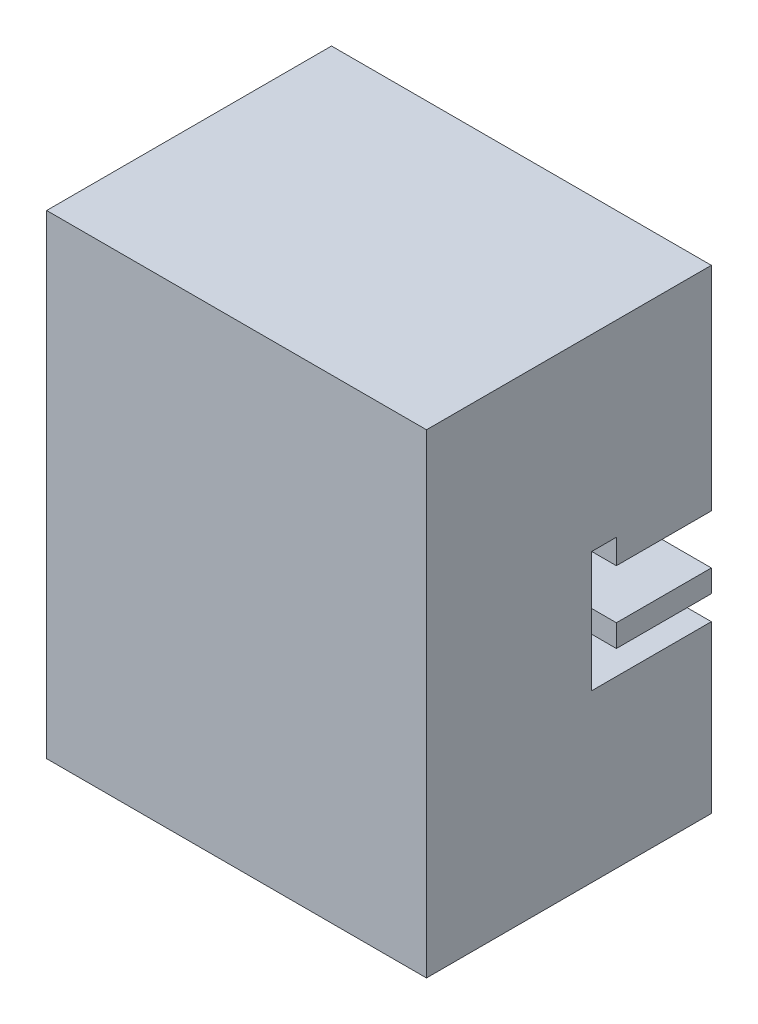
ISO-10303-21;
HEADER;
FILE_DESCRIPTION(('STEP AP214'),'2;1');
FILE_NAME('part.step','',(''),(''),'','','');
FILE_SCHEMA(('AUTOMOTIVE_DESIGN { 1 0 10303 214 1 1 1 1 }'));
ENDSEC;
DATA;
#1=APPLICATION_CONTEXT('core data for automotive mechanical design processes');
#2=APPLICATION_PROTOCOL_DEFINITION('international standard','automotive_design',2000,#1);
#3=PRODUCT_CONTEXT('',#1,'mechanical');
#4=PRODUCT('Part','Part','',(#3));
#5=PRODUCT_RELATED_PRODUCT_CATEGORY('part','',(#4));
#6=PRODUCT_DEFINITION_FORMATION('','',#4);
#7=PRODUCT_DEFINITION_CONTEXT('part definition',#1,'design');
#8=PRODUCT_DEFINITION('design','',#6,#7);
#9=PRODUCT_DEFINITION_SHAPE('','',#8);
#10=(LENGTH_UNIT() NAMED_UNIT(*) SI_UNIT(.MILLI.,.METRE.));
#11=(NAMED_UNIT(*) PLANE_ANGLE_UNIT() SI_UNIT($,.RADIAN.));
#12=(NAMED_UNIT(*) SI_UNIT($,.STERADIAN.) SOLID_ANGLE_UNIT());
#13=UNCERTAINTY_MEASURE_WITH_UNIT(LENGTH_MEASURE(1.E-05),#10,'distance_accuracy_value','');
#14=(GEOMETRIC_REPRESENTATION_CONTEXT(3) GLOBAL_UNCERTAINTY_ASSIGNED_CONTEXT((#13)) GLOBAL_UNIT_ASSIGNED_CONTEXT((#10,
#11,#12)) REPRESENTATION_CONTEXT('',''));
#15=CARTESIAN_POINT('',(0.,0.,0.));
#16=DIRECTION('',(0.,0.,1.));
#17=DIRECTION('',(1.,0.,0.));
#18=AXIS2_PLACEMENT_3D('',#15,#16,#17);
#19=CARTESIAN_POINT('',(0.,0.,30.));
#20=DIRECTION('',(1.,0.,0.));
#21=DIRECTION('',(0.,0.,-1.));
#22=AXIS2_PLACEMENT_3D('',#19,#20,#21);
#23=PLANE('',#22);
#24=DIRECTION('',(0.,1.,0.));
#25=VECTOR('',#24,1.);
#26=CARTESIAN_POINT('',(0.,30.2,12.6));
#27=LINE('',#26,#25);
#28=CARTESIAN_POINT('',(0.,17.5,12.6));
#29=VERTEX_POINT('',#28);
#30=CARTESIAN_POINT('',(0.,30.2,12.6));
#31=VERTEX_POINT('',#30);
#32=EDGE_CURVE('E73',#29,#31,#27,.T.);
#33=ORIENTED_EDGE('',*,*,#32,.F.);
#34=DIRECTION('',(0.,0.,-1.));
#35=VECTOR('',#34,1.);
#36=CARTESIAN_POINT('',(0.,17.5,53.8554238858359));
#37=LINE('',#36,#35);
#38=CARTESIAN_POINT('',(0.,17.5,0.));
#39=VERTEX_POINT('',#38);
#40=EDGE_CURVE('E180',#29,#39,#37,.T.);
#41=ORIENTED_EDGE('',*,*,#40,.T.);
#42=DIRECTION('',(0.,-1.,0.));
#43=VECTOR('',#42,1.);
#44=CARTESIAN_POINT('',(0.,0.,0.));
#45=LINE('',#44,#43);
#46=CARTESIAN_POINT('',(0.,0.,0.));
#47=VERTEX_POINT('',#46);
#48=EDGE_CURVE('E171',#39,#47,#45,.T.);
#49=ORIENTED_EDGE('',*,*,#48,.T.);
#50=DIRECTION('',(0.,0.,-1.));
#51=VECTOR('',#50,1.);
#52=CARTESIAN_POINT('',(0.,0.,30.));
#53=LINE('',#52,#51);
#54=CARTESIAN_POINT('',(0.,0.,30.));
#55=VERTEX_POINT('',#54);
#56=EDGE_CURVE('E235',#55,#47,#53,.T.);
#57=ORIENTED_EDGE('',*,*,#56,.F.);
#58=DIRECTION('',(0.,-1.,0.));
#59=VECTOR('',#58,1.);
#60=CARTESIAN_POINT('',(0.,0.,30.));
#61=LINE('',#60,#59);
#62=CARTESIAN_POINT('',(0.,50.,30.));
#63=VERTEX_POINT('',#62);
#64=EDGE_CURVE('E169',#63,#55,#61,.T.);
#65=ORIENTED_EDGE('',*,*,#64,.F.);
#66=DIRECTION('',(0.,0.,-1.));
#67=VECTOR('',#66,1.);
#68=CARTESIAN_POINT('',(0.,50.,30.));
#69=LINE('',#68,#67);
#70=CARTESIAN_POINT('',(0.,50.,0.));
#71=VERTEX_POINT('',#70);
#72=EDGE_CURVE('E155',#63,#71,#69,.T.);
#73=ORIENTED_EDGE('',*,*,#72,.T.);
#74=CARTESIAN_POINT('',(0.,27.6,0.));
#75=VERTEX_POINT('',#74);
#76=EDGE_CURVE('E166',#71,#75,#45,.T.);
#77=ORIENTED_EDGE('',*,*,#76,.T.);
#78=DIRECTION('',(0.,0.,-1.));
#79=VECTOR('',#78,1.);
#80=CARTESIAN_POINT('',(0.,27.6,0.));
#81=LINE('',#80,#79);
#82=CARTESIAN_POINT('',(0.,27.6,10.));
#83=VERTEX_POINT('',#82);
#84=EDGE_CURVE('E177',#83,#75,#81,.T.);
#85=ORIENTED_EDGE('',*,*,#84,.F.);
#86=DIRECTION('',(0.,-1.,0.));
#87=VECTOR('',#86,1.);
#88=CARTESIAN_POINT('',(0.,27.6,10.));
#89=LINE('',#88,#87);
#90=CARTESIAN_POINT('',(0.,30.2,10.));
#91=VERTEX_POINT('',#90);
#92=EDGE_CURVE('E203',#91,#83,#89,.T.);
#93=ORIENTED_EDGE('',*,*,#92,.F.);
#94=DIRECTION('',(0.,0.,-1.));
#95=VECTOR('',#94,1.);
#96=CARTESIAN_POINT('',(0.,30.2,10.));
#97=LINE('',#96,#95);
#98=EDGE_CURVE('E190',#31,#91,#97,.T.);
#99=ORIENTED_EDGE('',*,*,#98,.F.);
#100=EDGE_LOOP('',(#33,#41,#49,#57,#65,#73,#77,#85,#93,#99));
#101=FACE_BOUND('',#100,.T.);
#102=ADVANCED_FACE('F54',(#101),#23,.F.);
#103=CARTESIAN_POINT('',(0.,0.,0.));
#104=DIRECTION('',(0.,0.,-1.));
#105=DIRECTION('',(-1.,0.,0.));
#106=AXIS2_PLACEMENT_3D('',#103,#104,#105);
#107=PLANE('',#106);
#108=DIRECTION('',(-1.,0.,0.));
#109=VECTOR('',#108,1.);
#110=CARTESIAN_POINT('',(0.,17.5,0.));
#111=LINE('',#110,#109);
#112=CARTESIAN_POINT('',(40.,17.5,0.));
#113=VERTEX_POINT('',#112);
#114=EDGE_CURVE('E12',#113,#39,#111,.T.);
#115=ORIENTED_EDGE('',*,*,#114,.F.);
#116=DIRECTION('',(0.,1.,0.));
#117=VECTOR('',#116,1.);
#118=CARTESIAN_POINT('',(40.,0.,0.));
#119=LINE('',#118,#117);
#120=CARTESIAN_POINT('',(40.,0.,0.));
#121=VERTEX_POINT('',#120);
#122=EDGE_CURVE('E58',#121,#113,#119,.T.);
#123=ORIENTED_EDGE('',*,*,#122,.F.);
#124=DIRECTION('',(1.,0.,0.));
#125=VECTOR('',#124,1.);
#126=CARTESIAN_POINT('',(0.,0.,0.));
#127=LINE('',#126,#125);
#128=EDGE_CURVE('E220',#47,#121,#127,.T.);
#129=ORIENTED_EDGE('',*,*,#128,.F.);
#130=ORIENTED_EDGE('',*,*,#48,.F.);
#131=EDGE_LOOP('',(#115,#123,#129,#130));
#132=FACE_BOUND('',#131,.T.);
#133=ADVANCED_FACE('F254',(#132),#107,.T.);
#134=CARTESIAN_POINT('',(40.001,27.6,0.));
#135=DIRECTION('',(0.,1.,0.));
#136=DIRECTION('',(0.,0.,1.));
#137=AXIS2_PLACEMENT_3D('',#134,#135,#136);
#138=PLANE('',#137);
#139=DIRECTION('',(-1.,0.,0.));
#140=VECTOR('',#139,1.);
#141=CARTESIAN_POINT('',(40.001,27.6,10.));
#142=LINE('',#141,#140);
#143=CARTESIAN_POINT('',(40.,27.6,10.));
#144=VERTEX_POINT('',#143);
#145=EDGE_CURVE('E175',#144,#83,#142,.T.);
#146=ORIENTED_EDGE('',*,*,#145,.T.);
#147=ORIENTED_EDGE('',*,*,#84,.T.);
#148=DIRECTION('',(-1.,0.,0.));
#149=VECTOR('',#148,1.);
#150=CARTESIAN_POINT('',(40.001,27.6,0.));
#151=LINE('',#150,#149);
#152=CARTESIAN_POINT('',(40.,27.6,0.));
#153=VERTEX_POINT('',#152);
#154=EDGE_CURVE('E124',#153,#75,#151,.T.);
#155=ORIENTED_EDGE('',*,*,#154,.F.);
#156=DIRECTION('',(0.,0.,1.));
#157=VECTOR('',#156,1.);
#158=CARTESIAN_POINT('',(40.,27.6,0.));
#159=LINE('',#158,#157);
#160=EDGE_CURVE('E207',#153,#144,#159,.T.);
#161=ORIENTED_EDGE('',*,*,#160,.T.);
#162=EDGE_LOOP('',(#146,#147,#155,#161));
#163=FACE_BOUND('',#162,.T.);
#164=ADVANCED_FACE('F270',(#163),#138,.F.);
#165=CARTESIAN_POINT('',(40.001,30.2,12.6));
#166=DIRECTION('',(0.,0.,1.));
#167=DIRECTION('',(1.,0.,0.));
#168=AXIS2_PLACEMENT_3D('',#165,#166,#167);
#169=PLANE('',#168);
#170=DIRECTION('',(-1.,0.,0.));
#171=VECTOR('',#170,1.);
#172=CARTESIAN_POINT('',(40.001,30.2,12.6));
#173=LINE('',#172,#171);
#174=CARTESIAN_POINT('',(40.,30.2,12.6));
#175=VERTEX_POINT('',#174);
#176=EDGE_CURVE('E193',#175,#31,#173,.T.);
#177=ORIENTED_EDGE('',*,*,#176,.F.);
#178=DIRECTION('',(0.,-1.,0.));
#179=VECTOR('',#178,1.);
#180=CARTESIAN_POINT('',(40.,30.2,12.6));
#181=LINE('',#180,#179);
#182=CARTESIAN_POINT('',(40.,17.5,12.6));
#183=VERTEX_POINT('',#182);
#184=EDGE_CURVE('E90',#175,#183,#181,.T.);
#185=ORIENTED_EDGE('',*,*,#184,.T.);
#186=DIRECTION('',(-1.,0.,0.));
#187=VECTOR('',#186,1.);
#188=CARTESIAN_POINT('',(0.,17.5,12.6));
#189=LINE('',#188,#187);
#190=EDGE_CURVE('E188',#183,#29,#189,.T.);
#191=ORIENTED_EDGE('',*,*,#190,.T.);
#192=ORIENTED_EDGE('',*,*,#32,.T.);
#193=EDGE_LOOP('',(#177,#185,#191,#192));
#194=FACE_BOUND('',#193,.T.);
#195=ADVANCED_FACE('F273',(#194),#169,.F.);
#196=ORIENTED_EDGE('',*,*,#154,.T.);
#197=ORIENTED_EDGE('',*,*,#76,.F.);
#198=DIRECTION('',(-1.,0.,0.));
#199=VECTOR('',#198,1.);
#200=CARTESIAN_POINT('',(0.,50.,0.));
#201=LINE('',#200,#199);
#202=CARTESIAN_POINT('',(40.,50.,0.));
#203=VERTEX_POINT('',#202);
#204=EDGE_CURVE('E151',#203,#71,#201,.T.);
#205=ORIENTED_EDGE('',*,*,#204,.F.);
#206=EDGE_CURVE('E243',#153,#203,#119,.T.);
#207=ORIENTED_EDGE('',*,*,#206,.F.);
#208=EDGE_LOOP('',(#196,#197,#205,#207));
#209=FACE_BOUND('',#208,.T.);
#210=ADVANCED_FACE('F173',(#209),#107,.T.);
#211=CARTESIAN_POINT('',(0.,0.,30.));
#212=DIRECTION('',(0.,1.,0.));
#213=DIRECTION('',(0.,0.,1.));
#214=AXIS2_PLACEMENT_3D('',#211,#212,#213);
#215=PLANE('',#214);
#216=ORIENTED_EDGE('',*,*,#128,.T.);
#217=DIRECTION('',(0.,0.,-1.));
#218=VECTOR('',#217,1.);
#219=CARTESIAN_POINT('',(40.,0.,30.));
#220=LINE('',#219,#218);
#221=CARTESIAN_POINT('',(40.,0.,30.));
#222=VERTEX_POINT('',#221);
#223=EDGE_CURVE('E239',#222,#121,#220,.T.);
#224=ORIENTED_EDGE('',*,*,#223,.F.);
#225=DIRECTION('',(1.,0.,0.));
#226=VECTOR('',#225,1.);
#227=CARTESIAN_POINT('',(0.,0.,30.));
#228=LINE('',#227,#226);
#229=EDGE_CURVE('E226',#55,#222,#228,.T.);
#230=ORIENTED_EDGE('',*,*,#229,.F.);
#231=ORIENTED_EDGE('',*,*,#56,.T.);
#232=EDGE_LOOP('',(#216,#224,#230,#231));
#233=FACE_BOUND('',#232,.T.);
#234=ADVANCED_FACE('F272',(#233),#215,.F.);
#235=CARTESIAN_POINT('',(40.,0.,30.));
#236=DIRECTION('',(-1.,0.,0.));
#237=DIRECTION('',(0.,0.,1.));
#238=AXIS2_PLACEMENT_3D('',#235,#236,#237);
#239=PLANE('',#238);
#240=DIRECTION('',(0.,0.,-1.));
#241=VECTOR('',#240,1.);
#242=CARTESIAN_POINT('',(40.,17.5,53.8554238858359));
#243=LINE('',#242,#241);
#244=EDGE_CURVE('E65',#183,#113,#243,.T.);
#245=ORIENTED_EDGE('',*,*,#244,.F.);
#246=ORIENTED_EDGE('',*,*,#184,.F.);
#247=DIRECTION('',(0.,0.,1.));
#248=VECTOR('',#247,1.);
#249=CARTESIAN_POINT('',(40.,30.2,10.));
#250=LINE('',#249,#248);
#251=CARTESIAN_POINT('',(40.,30.2,10.));
#252=VERTEX_POINT('',#251);
#253=EDGE_CURVE('E199',#252,#175,#250,.T.);
#254=ORIENTED_EDGE('',*,*,#253,.F.);
#255=DIRECTION('',(0.,1.,0.));
#256=VECTOR('',#255,1.);
#257=CARTESIAN_POINT('',(40.,27.6,10.));
#258=LINE('',#257,#256);
#259=EDGE_CURVE('E210',#144,#252,#258,.T.);
#260=ORIENTED_EDGE('',*,*,#259,.F.);
#261=ORIENTED_EDGE('',*,*,#160,.F.);
#262=ORIENTED_EDGE('',*,*,#206,.T.);
#263=DIRECTION('',(0.,0.,-1.));
#264=VECTOR('',#263,1.);
#265=CARTESIAN_POINT('',(40.,50.,30.));
#266=LINE('',#265,#264);
#267=CARTESIAN_POINT('',(40.,50.,30.));
#268=VERTEX_POINT('',#267);
#269=EDGE_CURVE('E158',#268,#203,#266,.T.);
#270=ORIENTED_EDGE('',*,*,#269,.F.);
#271=DIRECTION('',(0.,1.,0.));
#272=VECTOR('',#271,1.);
#273=CARTESIAN_POINT('',(40.,0.,30.));
#274=LINE('',#273,#272);
#275=EDGE_CURVE('E229',#222,#268,#274,.T.);
#276=ORIENTED_EDGE('',*,*,#275,.F.);
#277=ORIENTED_EDGE('',*,*,#223,.T.);
#278=ORIENTED_EDGE('',*,*,#122,.T.);
#279=EDGE_LOOP('',(#245,#246,#254,#260,#261,#262,#270,#276,#277,#278));
#280=FACE_BOUND('',#279,.T.);
#281=ADVANCED_FACE('F56',(#280),#239,.F.);
#282=CARTESIAN_POINT('',(0.,50.,30.));
#283=DIRECTION('',(0.,-1.,0.));
#284=DIRECTION('',(0.,0.,-1.));
#285=AXIS2_PLACEMENT_3D('',#282,#283,#284);
#286=PLANE('',#285);
#287=ORIENTED_EDGE('',*,*,#204,.T.);
#288=ORIENTED_EDGE('',*,*,#72,.F.);
#289=DIRECTION('',(-1.,0.,0.));
#290=VECTOR('',#289,1.);
#291=CARTESIAN_POINT('',(0.,50.,30.));
#292=LINE('',#291,#290);
#293=EDGE_CURVE('E211',#268,#63,#292,.T.);
#294=ORIENTED_EDGE('',*,*,#293,.F.);
#295=ORIENTED_EDGE('',*,*,#269,.T.);
#296=EDGE_LOOP('',(#287,#288,#294,#295));
#297=FACE_BOUND('',#296,.T.);
#298=ADVANCED_FACE('F153',(#297),#286,.F.);
#299=CARTESIAN_POINT('',(0.,0.,30.));
#300=DIRECTION('',(0.,0.,-1.));
#301=DIRECTION('',(-1.,0.,0.));
#302=AXIS2_PLACEMENT_3D('',#299,#300,#301);
#303=PLANE('',#302);
#304=ORIENTED_EDGE('',*,*,#64,.T.);
#305=ORIENTED_EDGE('',*,*,#229,.T.);
#306=ORIENTED_EDGE('',*,*,#275,.T.);
#307=ORIENTED_EDGE('',*,*,#293,.T.);
#308=EDGE_LOOP('',(#304,#305,#306,#307));
#309=FACE_BOUND('',#308,.T.);
#310=ADVANCED_FACE('F284',(#309),#303,.F.);
#311=CARTESIAN_POINT('',(40.001,27.6,10.));
#312=DIRECTION('',(0.,0.,-1.));
#313=DIRECTION('',(0.,1.,0.));
#314=AXIS2_PLACEMENT_3D('',#311,#312,#313);
#315=PLANE('',#314);
#316=ORIENTED_EDGE('',*,*,#259,.T.);
#317=DIRECTION('',(-1.,0.,0.));
#318=VECTOR('',#317,1.);
#319=CARTESIAN_POINT('',(40.001,30.2,10.));
#320=LINE('',#319,#318);
#321=EDGE_CURVE('E115',#252,#91,#320,.T.);
#322=ORIENTED_EDGE('',*,*,#321,.T.);
#323=ORIENTED_EDGE('',*,*,#92,.T.);
#324=ORIENTED_EDGE('',*,*,#145,.F.);
#325=EDGE_LOOP('',(#316,#322,#323,#324));
#326=FACE_BOUND('',#325,.T.);
#327=ADVANCED_FACE('F262',(#326),#315,.F.);
#328=CARTESIAN_POINT('',(40.001,30.2,10.));
#329=DIRECTION('',(0.,1.,0.));
#330=DIRECTION('',(0.,0.,1.));
#331=AXIS2_PLACEMENT_3D('',#328,#329,#330);
#332=PLANE('',#331);
#333=ORIENTED_EDGE('',*,*,#253,.T.);
#334=ORIENTED_EDGE('',*,*,#176,.T.);
#335=ORIENTED_EDGE('',*,*,#98,.T.);
#336=ORIENTED_EDGE('',*,*,#321,.F.);
#337=EDGE_LOOP('',(#333,#334,#335,#336));
#338=FACE_BOUND('',#337,.T.);
#339=ADVANCED_FACE('F257',(#338),#332,.F.);
#340=CARTESIAN_POINT('',(0.,17.5,53.8554238858359));
#341=DIRECTION('',(0.,-1.,0.));
#342=DIRECTION('',(0.,0.,-1.));
#343=AXIS2_PLACEMENT_3D('',#340,#341,#342);
#344=PLANE('',#343);
#345=ORIENTED_EDGE('',*,*,#244,.T.);
#346=ORIENTED_EDGE('',*,*,#114,.T.);
#347=ORIENTED_EDGE('',*,*,#40,.F.);
#348=ORIENTED_EDGE('',*,*,#190,.F.);
#349=EDGE_LOOP('',(#345,#346,#347,#348));
#350=FACE_BOUND('',#349,.T.);
#351=ADVANCED_FACE('F255',(#350),#344,.F.);
#352=CLOSED_SHELL('',(#102,#133,#164,#195,#210,#234,#281,#298,#310,#327,#339,#351));
#353=MANIFOLD_SOLID_BREP('B2',#352);
#354=CARTESIAN_POINT('',(40.001,22.4,0.));
#355=DIRECTION('',(0.,-1.,0.));
#356=DIRECTION('',(0.,0.,-1.));
#357=AXIS2_PLACEMENT_3D('',#354,#355,#356);
#358=PLANE('',#357);
#359=DIRECTION('',(-1.,0.,0.));
#360=VECTOR('',#359,1.);
#361=CARTESIAN_POINT('',(40.001,22.4,0.));
#362=LINE('',#361,#360);
#363=CARTESIAN_POINT('',(40.,22.4,0.));
#364=VERTEX_POINT('',#363);
#365=CARTESIAN_POINT('',(25.05,22.4,0.));
#366=VERTEX_POINT('',#365);
#367=EDGE_CURVE('E460',#364,#366,#362,.T.);
#368=ORIENTED_EDGE('',*,*,#367,.T.);
#369=DIRECTION('',(0.,0.,1.));
#370=VECTOR('',#369,1.);
#371=CARTESIAN_POINT('',(25.05,22.4,0.));
#372=LINE('',#371,#370);
#373=CARTESIAN_POINT('',(25.05,22.4,10.));
#374=VERTEX_POINT('',#373);
#375=EDGE_CURVE('E432',#366,#374,#372,.T.);
#376=ORIENTED_EDGE('',*,*,#375,.T.);
#377=DIRECTION('',(-1.,0.,0.));
#378=VECTOR('',#377,1.);
#379=CARTESIAN_POINT('',(40.001,22.4,10.));
#380=LINE('',#379,#378);
#381=CARTESIAN_POINT('',(40.,22.4,10.));
#382=VERTEX_POINT('',#381);
#383=EDGE_CURVE('E450',#382,#374,#380,.T.);
#384=ORIENTED_EDGE('',*,*,#383,.F.);
#385=DIRECTION('',(0.,0.,-1.));
#386=VECTOR('',#385,1.);
#387=CARTESIAN_POINT('',(40.,22.4,0.));
#388=LINE('',#387,#386);
#389=EDGE_CURVE('E455',#382,#364,#388,.T.);
#390=ORIENTED_EDGE('',*,*,#389,.T.);
#391=EDGE_LOOP('',(#368,#376,#384,#390));
#392=FACE_BOUND('',#391,.T.);
#393=ADVANCED_FACE('F397',(#392),#358,.F.);
#394=CARTESIAN_POINT('',(40.001,22.4,10.));
#395=DIRECTION('',(0.,0.,-1.));
#396=DIRECTION('',(0.,1.,0.));
#397=AXIS2_PLACEMENT_3D('',#394,#395,#396);
#398=PLANE('',#397);
#399=ORIENTED_EDGE('',*,*,#383,.T.);
#400=DIRECTION('',(0.,-1.,0.));
#401=VECTOR('',#400,1.);
#402=CARTESIAN_POINT('',(25.05,22.4,10.));
#403=LINE('',#402,#401);
#404=CARTESIAN_POINT('',(25.05,20.05,10.));
#405=VERTEX_POINT('',#404);
#406=EDGE_CURVE('E457',#374,#405,#403,.T.);
#407=ORIENTED_EDGE('',*,*,#406,.T.);
#408=DIRECTION('',(1.,0.,0.));
#409=VECTOR('',#408,1.);
#410=CARTESIAN_POINT('',(40.001,20.05,10.));
#411=LINE('',#410,#409);
#412=CARTESIAN_POINT('',(40.,20.05,10.));
#413=VERTEX_POINT('',#412);
#414=EDGE_CURVE('E416',#405,#413,#411,.T.);
#415=ORIENTED_EDGE('',*,*,#414,.T.);
#416=DIRECTION('',(0.,1.,0.));
#417=VECTOR('',#416,1.);
#418=CARTESIAN_POINT('',(40.,22.4,10.));
#419=LINE('',#418,#417);
#420=EDGE_CURVE('E446',#413,#382,#419,.T.);
#421=ORIENTED_EDGE('',*,*,#420,.T.);
#422=EDGE_LOOP('',(#399,#407,#415,#421));
#423=FACE_BOUND('',#422,.T.);
#424=ADVANCED_FACE('F448',(#423),#398,.F.);
#425=CARTESIAN_POINT('',(0.,0.,0.));
#426=DIRECTION('',(0.,0.,-1.));
#427=DIRECTION('',(-1.,0.,0.));
#428=AXIS2_PLACEMENT_3D('',#425,#426,#427);
#429=PLANE('',#428);
#430=DIRECTION('',(0.,-1.,0.));
#431=VECTOR('',#430,1.);
#432=CARTESIAN_POINT('',(25.05,27.6,0.));
#433=LINE('',#432,#431);
#434=CARTESIAN_POINT('',(25.05,20.05,0.));
#435=VERTEX_POINT('',#434);
#436=EDGE_CURVE('E427',#366,#435,#433,.T.);
#437=ORIENTED_EDGE('',*,*,#436,.F.);
#438=ORIENTED_EDGE('',*,*,#367,.F.);
#439=DIRECTION('',(0.,1.,0.));
#440=VECTOR('',#439,1.);
#441=CARTESIAN_POINT('',(40.,0.,0.));
#442=LINE('',#441,#440);
#443=CARTESIAN_POINT('',(40.,20.05,0.));
#444=VERTEX_POINT('',#443);
#445=EDGE_CURVE('E401',#444,#364,#442,.T.);
#446=ORIENTED_EDGE('',*,*,#445,.F.);
#447=DIRECTION('',(1.,0.,0.));
#448=VECTOR('',#447,1.);
#449=CARTESIAN_POINT('',(25.05,20.05,0.));
#450=LINE('',#449,#448);
#451=EDGE_CURVE('E52',#435,#444,#450,.T.);
#452=ORIENTED_EDGE('',*,*,#451,.F.);
#453=EDGE_LOOP('',(#437,#438,#446,#452));
#454=FACE_BOUND('',#453,.T.);
#455=ADVANCED_FACE('F468',(#454),#429,.T.);
#456=CARTESIAN_POINT('',(40.,0.,30.));
#457=DIRECTION('',(-1.,0.,0.));
#458=DIRECTION('',(0.,0.,1.));
#459=AXIS2_PLACEMENT_3D('',#456,#457,#458);
#460=PLANE('',#459);
#461=ORIENTED_EDGE('',*,*,#420,.F.);
#462=DIRECTION('',(0.,0.,-1.));
#463=VECTOR('',#462,1.);
#464=CARTESIAN_POINT('',(40.,20.05,53.8554238858359));
#465=LINE('',#464,#463);
#466=EDGE_CURVE('E451',#413,#444,#465,.T.);
#467=ORIENTED_EDGE('',*,*,#466,.T.);
#468=ORIENTED_EDGE('',*,*,#445,.T.);
#469=ORIENTED_EDGE('',*,*,#389,.F.);
#470=EDGE_LOOP('',(#461,#467,#468,#469));
#471=FACE_BOUND('',#470,.T.);
#472=ADVANCED_FACE('F399',(#471),#460,.F.);
#473=CARTESIAN_POINT('',(25.05,27.6,53.8554238858359));
#474=DIRECTION('',(1.,0.,0.));
#475=DIRECTION('',(0.,1.,0.));
#476=AXIS2_PLACEMENT_3D('',#473,#474,#475);
#477=PLANE('',#476);
#478=ORIENTED_EDGE('',*,*,#375,.F.);
#479=ORIENTED_EDGE('',*,*,#436,.T.);
#480=DIRECTION('',(0.,0.,-1.));
#481=VECTOR('',#480,1.);
#482=CARTESIAN_POINT('',(25.05,20.05,53.8554238858359));
#483=LINE('',#482,#481);
#484=EDGE_CURVE('E407',#405,#435,#483,.T.);
#485=ORIENTED_EDGE('',*,*,#484,.F.);
#486=ORIENTED_EDGE('',*,*,#406,.F.);
#487=EDGE_LOOP('',(#478,#479,#485,#486));
#488=FACE_BOUND('',#487,.T.);
#489=ADVANCED_FACE('F471',(#488),#477,.F.);
#490=CARTESIAN_POINT('',(25.05,20.05,53.8554238858359));
#491=DIRECTION('',(0.,1.,0.));
#492=DIRECTION('',(0.,0.,1.));
#493=AXIS2_PLACEMENT_3D('',#490,#491,#492);
#494=PLANE('',#493);
#495=ORIENTED_EDGE('',*,*,#484,.T.);
#496=ORIENTED_EDGE('',*,*,#451,.T.);
#497=ORIENTED_EDGE('',*,*,#466,.F.);
#498=ORIENTED_EDGE('',*,*,#414,.F.);
#499=EDGE_LOOP('',(#495,#496,#497,#498));
#500=FACE_BOUND('',#499,.T.);
#501=ADVANCED_FACE('F470',(#500),#494,.F.);
#502=CLOSED_SHELL('',(#393,#424,#455,#472,#489,#501));
#503=MANIFOLD_SOLID_BREP('B6',#502);
#504=CARTESIAN_POINT('',(40.001,22.4,0.));
#505=DIRECTION('',(0.,-1.,0.));
#506=DIRECTION('',(0.,0.,-1.));
#507=AXIS2_PLACEMENT_3D('',#504,#505,#506);
#508=PLANE('',#507);
#509=DIRECTION('',(-1.,0.,0.));
#510=VECTOR('',#509,1.);
#511=CARTESIAN_POINT('',(40.001,22.4,10.));
#512=LINE('',#511,#510);
#513=CARTESIAN_POINT('',(14.95,22.4,10.));
#514=VERTEX_POINT('',#513);
#515=CARTESIAN_POINT('',(0.,22.4,10.));
#516=VERTEX_POINT('',#515);
#517=EDGE_CURVE('E556',#514,#516,#512,.T.);
#518=ORIENTED_EDGE('',*,*,#517,.F.);
#519=DIRECTION('',(0.,0.,-1.));
#520=VECTOR('',#519,1.);
#521=CARTESIAN_POINT('',(14.95,22.4,0.));
#522=LINE('',#521,#520);
#523=CARTESIAN_POINT('',(14.95,22.4,0.));
#524=VERTEX_POINT('',#523);
#525=EDGE_CURVE('E541',#514,#524,#522,.T.);
#526=ORIENTED_EDGE('',*,*,#525,.T.);
#527=DIRECTION('',(-1.,0.,0.));
#528=VECTOR('',#527,1.);
#529=CARTESIAN_POINT('',(40.001,22.4,0.));
#530=LINE('',#529,#528);
#531=CARTESIAN_POINT('',(0.,22.4,0.));
#532=VERTEX_POINT('',#531);
#533=EDGE_CURVE('E595',#524,#532,#530,.T.);
#534=ORIENTED_EDGE('',*,*,#533,.T.);
#535=DIRECTION('',(0.,0.,1.));
#536=VECTOR('',#535,1.);
#537=CARTESIAN_POINT('',(0.,22.4,0.));
#538=LINE('',#537,#536);
#539=EDGE_CURVE('E593',#532,#516,#538,.T.);
#540=ORIENTED_EDGE('',*,*,#539,.T.);
#541=EDGE_LOOP('',(#518,#526,#534,#540));
#542=FACE_BOUND('',#541,.T.);
#543=ADVANCED_FACE('F533',(#542),#508,.F.);
#544=CARTESIAN_POINT('',(40.001,22.4,10.));
#545=DIRECTION('',(0.,0.,-1.));
#546=DIRECTION('',(0.,1.,0.));
#547=AXIS2_PLACEMENT_3D('',#544,#545,#546);
#548=PLANE('',#547);
#549=DIRECTION('',(1.,0.,0.));
#550=VECTOR('',#549,1.);
#551=CARTESIAN_POINT('',(40.001,20.05,10.));
#552=LINE('',#551,#550);
#553=CARTESIAN_POINT('',(0.,20.05,10.));
#554=VERTEX_POINT('',#553);
#555=CARTESIAN_POINT('',(14.95,20.05,10.));
#556=VERTEX_POINT('',#555);
#557=EDGE_CURVE('E395',#554,#556,#552,.T.);
#558=ORIENTED_EDGE('',*,*,#557,.T.);
#559=DIRECTION('',(0.,1.,0.));
#560=VECTOR('',#559,1.);
#561=CARTESIAN_POINT('',(14.95,22.4,10.));
#562=LINE('',#561,#560);
#563=EDGE_CURVE('E602',#556,#514,#562,.T.);
#564=ORIENTED_EDGE('',*,*,#563,.T.);
#565=ORIENTED_EDGE('',*,*,#517,.T.);
#566=DIRECTION('',(0.,-1.,0.));
#567=VECTOR('',#566,1.);
#568=CARTESIAN_POINT('',(0.,22.4,10.));
#569=LINE('',#568,#567);
#570=EDGE_CURVE('E598',#516,#554,#569,.T.);
#571=ORIENTED_EDGE('',*,*,#570,.T.);
#572=EDGE_LOOP('',(#558,#564,#565,#571));
#573=FACE_BOUND('',#572,.T.);
#574=ADVANCED_FACE('F606',(#573),#548,.F.);
#575=CARTESIAN_POINT('',(0.,0.,0.));
#576=DIRECTION('',(0.,0.,-1.));
#577=DIRECTION('',(-1.,0.,0.));
#578=AXIS2_PLACEMENT_3D('',#575,#576,#577);
#579=PLANE('',#578);
#580=DIRECTION('',(0.,1.,0.));
#581=VECTOR('',#580,1.);
#582=CARTESIAN_POINT('',(14.95,27.6,0.));
#583=LINE('',#582,#581);
#584=CARTESIAN_POINT('',(14.95,20.05,0.));
#585=VERTEX_POINT('',#584);
#586=EDGE_CURVE('E548',#585,#524,#583,.T.);
#587=ORIENTED_EDGE('',*,*,#586,.F.);
#588=DIRECTION('',(1.,0.,0.));
#589=VECTOR('',#588,1.);
#590=CARTESIAN_POINT('',(14.95,20.05,0.));
#591=LINE('',#590,#589);
#592=CARTESIAN_POINT('',(0.,20.05,0.));
#593=VERTEX_POINT('',#592);
#594=EDGE_CURVE('E580',#593,#585,#591,.T.);
#595=ORIENTED_EDGE('',*,*,#594,.F.);
#596=DIRECTION('',(0.,-1.,0.));
#597=VECTOR('',#596,1.);
#598=CARTESIAN_POINT('',(0.,0.,0.));
#599=LINE('',#598,#597);
#600=EDGE_CURVE('E590',#532,#593,#599,.T.);
#601=ORIENTED_EDGE('',*,*,#600,.F.);
#602=ORIENTED_EDGE('',*,*,#533,.F.);
#603=EDGE_LOOP('',(#587,#595,#601,#602));
#604=FACE_BOUND('',#603,.T.);
#605=ADVANCED_FACE('F588',(#604),#579,.T.);
#606=CARTESIAN_POINT('',(0.,0.,30.));
#607=DIRECTION('',(1.,0.,0.));
#608=DIRECTION('',(0.,0.,-1.));
#609=AXIS2_PLACEMENT_3D('',#606,#607,#608);
#610=PLANE('',#609);
#611=ORIENTED_EDGE('',*,*,#600,.T.);
#612=DIRECTION('',(0.,0.,-1.));
#613=VECTOR('',#612,1.);
#614=CARTESIAN_POINT('',(0.,20.05,53.8554238858359));
#615=LINE('',#614,#613);
#616=EDGE_CURVE('E576',#554,#593,#615,.T.);
#617=ORIENTED_EDGE('',*,*,#616,.F.);
#618=ORIENTED_EDGE('',*,*,#570,.F.);
#619=ORIENTED_EDGE('',*,*,#539,.F.);
#620=EDGE_LOOP('',(#611,#617,#618,#619));
#621=FACE_BOUND('',#620,.T.);
#622=ADVANCED_FACE('F535',(#621),#610,.F.);
#623=CARTESIAN_POINT('',(14.95,27.6,53.8554238858359));
#624=DIRECTION('',(-1.,0.,0.));
#625=DIRECTION('',(0.,-1.,0.));
#626=AXIS2_PLACEMENT_3D('',#623,#624,#625);
#627=PLANE('',#626);
#628=DIRECTION('',(0.,0.,-1.));
#629=VECTOR('',#628,1.);
#630=CARTESIAN_POINT('',(14.95,20.05,53.8554238858359));
#631=LINE('',#630,#629);
#632=EDGE_CURVE('E584',#556,#585,#631,.T.);
#633=ORIENTED_EDGE('',*,*,#632,.T.);
#634=ORIENTED_EDGE('',*,*,#586,.T.);
#635=ORIENTED_EDGE('',*,*,#525,.F.);
#636=ORIENTED_EDGE('',*,*,#563,.F.);
#637=EDGE_LOOP('',(#633,#634,#635,#636));
#638=FACE_BOUND('',#637,.T.);
#639=ADVANCED_FACE('F605',(#638),#627,.F.);
#640=CARTESIAN_POINT('',(14.95,20.05,53.8554238858359));
#641=DIRECTION('',(0.,1.,0.));
#642=DIRECTION('',(0.,0.,1.));
#643=AXIS2_PLACEMENT_3D('',#640,#641,#642);
#644=PLANE('',#643);
#645=ORIENTED_EDGE('',*,*,#616,.T.);
#646=ORIENTED_EDGE('',*,*,#594,.T.);
#647=ORIENTED_EDGE('',*,*,#632,.F.);
#648=ORIENTED_EDGE('',*,*,#557,.F.);
#649=EDGE_LOOP('',(#645,#646,#647,#648));
#650=FACE_BOUND('',#649,.T.);
#651=ADVANCED_FACE('F578',(#650),#644,.F.);
#652=CLOSED_SHELL('',(#543,#574,#605,#622,#639,#651));
#653=MANIFOLD_SOLID_BREP('B46',#652);
#654=ADVANCED_BREP_SHAPE_REPRESENTATION('',(#18,#353,#503,#653),#14);
#655=SHAPE_DEFINITION_REPRESENTATION(#9,#654);
ENDSEC;
END-ISO-10303-21;
